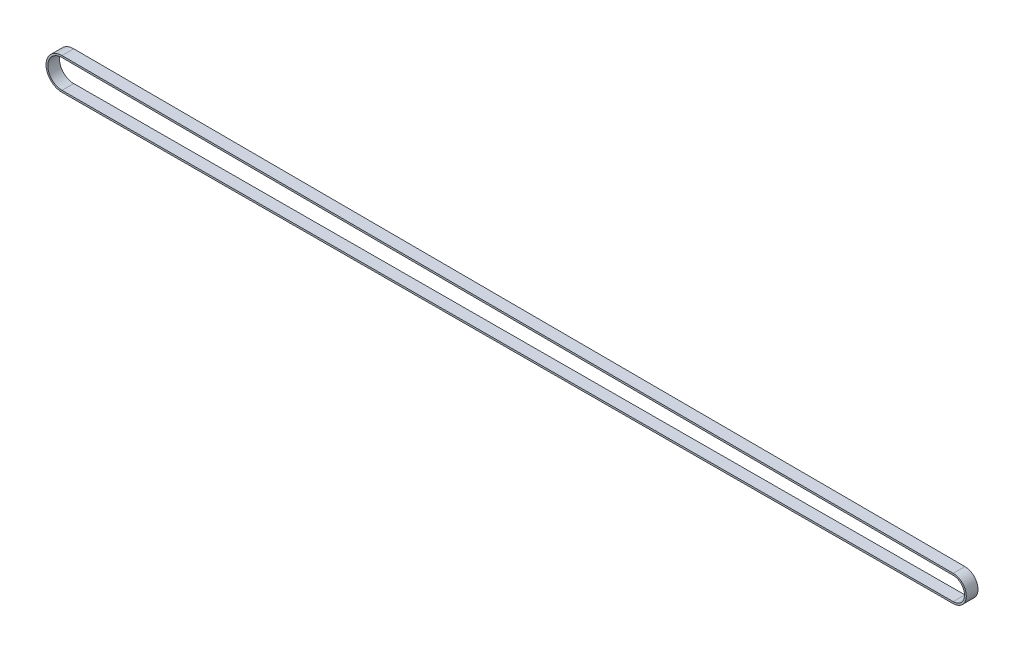
ISO-10303-21;
HEADER;
FILE_DESCRIPTION(('STEP AP214'),'2;1');
FILE_NAME('part.step','',(''),(''),'','','');
FILE_SCHEMA(('AUTOMOTIVE_DESIGN { 1 0 10303 214 1 1 1 1 }'));
ENDSEC;
DATA;
#1=APPLICATION_CONTEXT('core data for automotive mechanical design processes');
#2=APPLICATION_PROTOCOL_DEFINITION('international standard','automotive_design',2000,#1);
#3=PRODUCT_CONTEXT('',#1,'mechanical');
#4=PRODUCT('Part','Part','',(#3));
#5=PRODUCT_RELATED_PRODUCT_CATEGORY('part','',(#4));
#6=PRODUCT_DEFINITION_FORMATION('','',#4);
#7=PRODUCT_DEFINITION_CONTEXT('part definition',#1,'design');
#8=PRODUCT_DEFINITION('design','',#6,#7);
#9=PRODUCT_DEFINITION_SHAPE('','',#8);
#10=(LENGTH_UNIT() NAMED_UNIT(*) SI_UNIT(.MILLI.,.METRE.));
#11=(NAMED_UNIT(*) PLANE_ANGLE_UNIT() SI_UNIT($,.RADIAN.));
#12=(NAMED_UNIT(*) SI_UNIT($,.STERADIAN.) SOLID_ANGLE_UNIT());
#13=UNCERTAINTY_MEASURE_WITH_UNIT(LENGTH_MEASURE(1.E-05),#10,'distance_accuracy_value','');
#14=(GEOMETRIC_REPRESENTATION_CONTEXT(3) GLOBAL_UNCERTAINTY_ASSIGNED_CONTEXT((#13)) GLOBAL_UNIT_ASSIGNED_CONTEXT((#10,
#11,#12)) REPRESENTATION_CONTEXT('',''));
#15=CARTESIAN_POINT('',(0.,0.,0.));
#16=DIRECTION('',(0.,0.,1.));
#17=DIRECTION('',(1.,0.,0.));
#18=AXIS2_PLACEMENT_3D('',#15,#16,#17);
#19=CARTESIAN_POINT('',(-380.500000000015,-37.893771705038,2.5));
#20=DIRECTION('',(0.,0.,-1.));
#21=DIRECTION('',(-1.,0.,0.));
#22=AXIS2_PLACEMENT_3D('',#19,#20,#21);
#23=CYLINDRICAL_SURFACE('',#22,6.812);
#24=CARTESIAN_POINT('',(-380.500000000015,-37.893771705038,-2.5));
#25=DIRECTION('',(0.,0.,-1.));
#26=DIRECTION('',(-1.,0.,0.));
#27=AXIS2_PLACEMENT_3D('',#24,#25,#26);
#28=CIRCLE('',#27,6.812);
#29=CARTESIAN_POINT('',(-380.478516688583,-44.70573782851,-2.5));
#30=VERTEX_POINT('',#29);
#31=CARTESIAN_POINT('',(-380.478516688582,-31.081805581566,-2.5));
#32=VERTEX_POINT('',#31);
#33=EDGE_CURVE('E157',#30,#32,#28,.T.);
#34=ORIENTED_EDGE('',*,*,#33,.F.);
#35=DIRECTION('',(0.,0.,-1.));
#36=VECTOR('',#35,1.);
#37=CARTESIAN_POINT('',(-380.478516688583,-44.70573782851,2.5));
#38=LINE('',#37,#36);
#39=CARTESIAN_POINT('',(-380.478516688583,-44.70573782851,2.5));
#40=VERTEX_POINT('',#39);
#41=EDGE_CURVE('E12',#40,#30,#38,.T.);
#42=ORIENTED_EDGE('',*,*,#41,.F.);
#43=CARTESIAN_POINT('',(-380.500000000015,-37.893771705038,2.5));
#44=DIRECTION('',(0.,0.,-1.));
#45=DIRECTION('',(-1.,0.,0.));
#46=AXIS2_PLACEMENT_3D('',#43,#44,#45);
#47=CIRCLE('',#46,6.812);
#48=CARTESIAN_POINT('',(-380.478516688582,-31.081805581566,2.5));
#49=VERTEX_POINT('',#48);
#50=EDGE_CURVE('E161',#40,#49,#47,.T.);
#51=ORIENTED_EDGE('',*,*,#50,.T.);
#52=DIRECTION('',(0.,0.,-1.));
#53=VECTOR('',#52,1.);
#54=CARTESIAN_POINT('',(-380.478516688582,-31.081805581566,2.5));
#55=LINE('',#54,#53);
#56=EDGE_CURVE('E62',#49,#32,#55,.T.);
#57=ORIENTED_EDGE('',*,*,#56,.T.);
#58=EDGE_LOOP('',(#34,#42,#51,#57));
#59=FACE_BOUND('',#58,.T.);
#60=ADVANCED_FACE('F59',(#59),#23,.T.);
#61=CARTESIAN_POINT('',(-380.478516688583,-44.70573782851,2.5));
#62=DIRECTION('',(0.00315374507221117,-0.999995026933644,0.));
#63=DIRECTION('',(0.999995026933644,0.00315374507221117,0.));
#64=AXIS2_PLACEMENT_3D('',#61,#62,#63);
#65=PLANE('',#64);
#66=DIRECTION('',(-0.999995026933644,-0.00315374507221117,0.));
#67=VECTOR('',#66,1.);
#68=CARTESIAN_POINT('',(-380.478516688583,-44.70573782851,-2.5));
#69=LINE('',#68,#67);
#70=CARTESIAN_POINT('',(0.0176988173309971,-43.5057437962133,-2.5));
#71=VERTEX_POINT('',#70);
#72=EDGE_CURVE('E165',#71,#30,#69,.T.);
#73=ORIENTED_EDGE('',*,*,#72,.F.);
#74=DIRECTION('',(0.,0.,-1.));
#75=VECTOR('',#74,1.);
#76=CARTESIAN_POINT('',(0.0176988173309971,-43.5057437962133,2.5));
#77=LINE('',#76,#75);
#78=CARTESIAN_POINT('',(0.0176988173309971,-43.5057437962133,2.5));
#79=VERTEX_POINT('',#78);
#80=EDGE_CURVE('E67',#79,#71,#77,.T.);
#81=ORIENTED_EDGE('',*,*,#80,.F.);
#82=DIRECTION('',(-0.999995026933644,-0.00315374507221117,0.));
#83=VECTOR('',#82,1.);
#84=CARTESIAN_POINT('',(-380.478516688583,-44.70573782851,2.5));
#85=LINE('',#84,#83);
#86=EDGE_CURVE('E171',#79,#40,#85,.T.);
#87=ORIENTED_EDGE('',*,*,#86,.T.);
#88=ORIENTED_EDGE('',*,*,#41,.T.);
#89=EDGE_LOOP('',(#73,#81,#87,#88));
#90=FACE_BOUND('',#89,.T.);
#91=ADVANCED_FACE('F197',(#90),#65,.T.);
#92=CARTESIAN_POINT('',(-1.42524880786254E-11,-37.8937717050617,2.5));
#93=DIRECTION('',(0.,0.,-1.));
#94=DIRECTION('',(-1.,0.,0.));
#95=AXIS2_PLACEMENT_3D('',#92,#93,#94);
#96=CYLINDRICAL_SURFACE('',#95,5.612);
#97=CARTESIAN_POINT('',(-1.42524880786254E-11,-37.8937717050617,-2.5));
#98=DIRECTION('',(0.,0.,-1.));
#99=DIRECTION('',(-1.,0.,0.));
#100=AXIS2_PLACEMENT_3D('',#97,#98,#99);
#101=CIRCLE('',#100,5.612);
#102=CARTESIAN_POINT('',(0.0176988173316572,-32.2817996139101,-2.5));
#103=VERTEX_POINT('',#102);
#104=EDGE_CURVE('E179',#103,#71,#101,.T.);
#105=ORIENTED_EDGE('',*,*,#104,.F.);
#106=DIRECTION('',(0.,0.,-1.));
#107=VECTOR('',#106,1.);
#108=CARTESIAN_POINT('',(0.0176988173316572,-32.2817996139101,2.5));
#109=LINE('',#108,#107);
#110=CARTESIAN_POINT('',(0.0176988173316572,-32.2817996139101,2.5));
#111=VERTEX_POINT('',#110);
#112=EDGE_CURVE('E184',#111,#103,#109,.T.);
#113=ORIENTED_EDGE('',*,*,#112,.F.);
#114=CARTESIAN_POINT('',(-1.42524880786254E-11,-37.8937717050617,2.5));
#115=DIRECTION('',(0.,0.,-1.));
#116=DIRECTION('',(-1.,0.,0.));
#117=AXIS2_PLACEMENT_3D('',#114,#115,#116);
#118=CIRCLE('',#117,5.612);
#119=EDGE_CURVE('E168',#111,#79,#118,.T.);
#120=ORIENTED_EDGE('',*,*,#119,.T.);
#121=ORIENTED_EDGE('',*,*,#80,.T.);
#122=EDGE_LOOP('',(#105,#113,#120,#121));
#123=FACE_BOUND('',#122,.T.);
#124=ADVANCED_FACE('F201',(#123),#96,.T.);
#125=CARTESIAN_POINT('',(-380.478516688582,-31.081805581566,2.5));
#126=DIRECTION('',(0.00315374507233547,0.999995026933644,0.));
#127=DIRECTION('',(-0.999995026933644,0.00315374507233547,0.));
#128=AXIS2_PLACEMENT_3D('',#125,#126,#127);
#129=PLANE('',#128);
#130=DIRECTION('',(0.999995026933644,-0.00315374507233546,0.));
#131=VECTOR('',#130,1.);
#132=CARTESIAN_POINT('',(-380.478516688582,-31.081805581566,-2.5));
#133=LINE('',#132,#131);
#134=EDGE_CURVE('E176',#32,#103,#133,.T.);
#135=ORIENTED_EDGE('',*,*,#134,.F.);
#136=ORIENTED_EDGE('',*,*,#56,.F.);
#137=DIRECTION('',(0.999995026933644,-0.00315374507233546,0.));
#138=VECTOR('',#137,1.);
#139=CARTESIAN_POINT('',(-380.478516688582,-31.081805581566,2.5));
#140=LINE('',#139,#138);
#141=EDGE_CURVE('E164',#49,#111,#140,.T.);
#142=ORIENTED_EDGE('',*,*,#141,.T.);
#143=ORIENTED_EDGE('',*,*,#112,.T.);
#144=EDGE_LOOP('',(#135,#136,#142,#143));
#145=FACE_BOUND('',#144,.T.);
#146=ADVANCED_FACE('F192',(#145),#129,.T.);
#147=CARTESIAN_POINT('',(-380.500000000015,-37.893771705038,2.5));
#148=DIRECTION('',(0.,0.,-1.));
#149=DIRECTION('',(-1.,0.,0.));
#150=AXIS2_PLACEMENT_3D('',#147,#148,#149);
#151=PLANE('',#150);
#152=DIRECTION('',(-0.999995026933644,-0.00315374507221117,0.));
#153=VECTOR('',#152,1.);
#154=CARTESIAN_POINT('',(-380.480919842328,-43.9437416179866,2.5));
#155=LINE('',#154,#153);
#156=CARTESIAN_POINT('',(0.0152956635859721,-42.7437475856898,2.5));
#157=VERTEX_POINT('',#156);
#158=CARTESIAN_POINT('',(-380.480919842328,-43.9437416179866,2.5));
#159=VERTEX_POINT('',#158);
#160=EDGE_CURVE('E132',#157,#159,#155,.T.);
#161=ORIENTED_EDGE('',*,*,#160,.T.);
#162=CARTESIAN_POINT('',(-380.500000000015,-37.893771705038,2.5));
#163=DIRECTION('',(0.,0.,-1.));
#164=DIRECTION('',(-1.,0.,0.));
#165=AXIS2_PLACEMENT_3D('',#162,#163,#164);
#166=CIRCLE('',#165,6.05);
#167=CARTESIAN_POINT('',(-380.480919842327,-31.8438017920895,2.5));
#168=VERTEX_POINT('',#167);
#169=EDGE_CURVE('E126',#159,#168,#166,.T.);
#170=ORIENTED_EDGE('',*,*,#169,.T.);
#171=DIRECTION('',(0.999995026933644,-0.00315374507233546,0.));
#172=VECTOR('',#171,1.);
#173=CARTESIAN_POINT('',(-380.480919842327,-31.8438017920895,2.5));
#174=LINE('',#173,#172);
#175=CARTESIAN_POINT('',(0.0152956635864898,-33.0437958244335,2.5));
#176=VERTEX_POINT('',#175);
#177=EDGE_CURVE('E135',#168,#176,#174,.T.);
#178=ORIENTED_EDGE('',*,*,#177,.T.);
#179=CARTESIAN_POINT('',(-1.42524880786254E-11,-37.8937717050617,2.5));
#180=DIRECTION('',(0.,0.,-1.));
#181=DIRECTION('',(-1.,0.,0.));
#182=AXIS2_PLACEMENT_3D('',#179,#180,#181);
#183=CIRCLE('',#182,4.85);
#184=EDGE_CURVE('E75',#176,#157,#183,.T.);
#185=ORIENTED_EDGE('',*,*,#184,.T.);
#186=EDGE_LOOP('',(#161,#170,#178,#185));
#187=FACE_BOUND('',#186,.T.);
#188=ORIENTED_EDGE('',*,*,#50,.F.);
#189=ORIENTED_EDGE('',*,*,#86,.F.);
#190=ORIENTED_EDGE('',*,*,#119,.F.);
#191=ORIENTED_EDGE('',*,*,#141,.F.);
#192=EDGE_LOOP('',(#188,#189,#190,#191));
#193=FACE_BOUND('',#192,.T.);
#194=ADVANCED_FACE('F139',(#187,#193),#151,.F.);
#195=CARTESIAN_POINT('',(-380.500000000015,-37.893771705038,-2.5));
#196=DIRECTION('',(0.,0.,-1.));
#197=DIRECTION('',(-1.,0.,0.));
#198=AXIS2_PLACEMENT_3D('',#195,#196,#197);
#199=PLANE('',#198);
#200=CARTESIAN_POINT('',(-380.500000000015,-37.893771705038,-2.5));
#201=DIRECTION('',(0.,0.,-1.));
#202=DIRECTION('',(-1.,0.,0.));
#203=AXIS2_PLACEMENT_3D('',#200,#201,#202);
#204=CIRCLE('',#203,6.05);
#205=CARTESIAN_POINT('',(-380.480919842328,-43.9437416179866,-2.5));
#206=VERTEX_POINT('',#205);
#207=CARTESIAN_POINT('',(-380.480919842327,-31.8438017920895,-2.5));
#208=VERTEX_POINT('',#207);
#209=EDGE_CURVE('E83',#206,#208,#204,.T.);
#210=ORIENTED_EDGE('',*,*,#209,.F.);
#211=DIRECTION('',(-0.999995026933644,-0.00315374507221117,0.));
#212=VECTOR('',#211,1.);
#213=CARTESIAN_POINT('',(-380.480919842328,-43.9437416179866,-2.5));
#214=LINE('',#213,#212);
#215=CARTESIAN_POINT('',(0.0152956635859721,-42.7437475856898,-2.5));
#216=VERTEX_POINT('',#215);
#217=EDGE_CURVE('E142',#216,#206,#214,.T.);
#218=ORIENTED_EDGE('',*,*,#217,.F.);
#219=CARTESIAN_POINT('',(-1.42524880786254E-11,-37.8937717050617,-2.5));
#220=DIRECTION('',(0.,0.,-1.));
#221=DIRECTION('',(-1.,0.,0.));
#222=AXIS2_PLACEMENT_3D('',#219,#220,#221);
#223=CIRCLE('',#222,4.85);
#224=CARTESIAN_POINT('',(0.0152956635865453,-33.0437958244335,-2.5));
#225=VERTEX_POINT('',#224);
#226=EDGE_CURVE('E145',#225,#216,#223,.T.);
#227=ORIENTED_EDGE('',*,*,#226,.F.);
#228=DIRECTION('',(0.999995026933644,-0.00315374507233546,0.));
#229=VECTOR('',#228,1.);
#230=CARTESIAN_POINT('',(-380.480919842327,-31.8438017920895,-2.5));
#231=LINE('',#230,#229);
#232=EDGE_CURVE('E151',#208,#225,#231,.T.);
#233=ORIENTED_EDGE('',*,*,#232,.F.);
#234=EDGE_LOOP('',(#210,#218,#227,#233));
#235=FACE_BOUND('',#234,.T.);
#236=ORIENTED_EDGE('',*,*,#33,.T.);
#237=ORIENTED_EDGE('',*,*,#134,.T.);
#238=ORIENTED_EDGE('',*,*,#104,.T.);
#239=ORIENTED_EDGE('',*,*,#72,.T.);
#240=EDGE_LOOP('',(#236,#237,#238,#239));
#241=FACE_BOUND('',#240,.T.);
#242=ADVANCED_FACE('F194',(#235,#241),#199,.T.);
#243=CARTESIAN_POINT('',(-380.500000000015,-37.893771705038,2.5));
#244=DIRECTION('',(0.,0.,-1.));
#245=DIRECTION('',(-1.,0.,0.));
#246=AXIS2_PLACEMENT_3D('',#243,#244,#245);
#247=CYLINDRICAL_SURFACE('',#246,6.05);
#248=ORIENTED_EDGE('',*,*,#209,.T.);
#249=DIRECTION('',(0.,0.,-1.));
#250=VECTOR('',#249,1.);
#251=CARTESIAN_POINT('',(-380.480919842327,-31.8438017920895,2.5));
#252=LINE('',#251,#250);
#253=EDGE_CURVE('E122',#168,#208,#252,.T.);
#254=ORIENTED_EDGE('',*,*,#253,.F.);
#255=ORIENTED_EDGE('',*,*,#169,.F.);
#256=DIRECTION('',(0.,0.,-1.));
#257=VECTOR('',#256,1.);
#258=CARTESIAN_POINT('',(-380.480919842328,-43.9437416179866,2.5));
#259=LINE('',#258,#257);
#260=EDGE_CURVE('E155',#159,#206,#259,.T.);
#261=ORIENTED_EDGE('',*,*,#260,.T.);
#262=EDGE_LOOP('',(#248,#254,#255,#261));
#263=FACE_BOUND('',#262,.T.);
#264=ADVANCED_FACE('F124',(#263),#247,.F.);
#265=CARTESIAN_POINT('',(-380.480919842328,-43.9437416179866,2.5));
#266=DIRECTION('',(0.00315374507221117,-0.999995026933644,0.));
#267=DIRECTION('',(0.999995026933644,0.00315374507221117,0.));
#268=AXIS2_PLACEMENT_3D('',#265,#266,#267);
#269=PLANE('',#268);
#270=ORIENTED_EDGE('',*,*,#217,.T.);
#271=ORIENTED_EDGE('',*,*,#260,.F.);
#272=ORIENTED_EDGE('',*,*,#160,.F.);
#273=DIRECTION('',(0.,0.,-1.));
#274=VECTOR('',#273,1.);
#275=CARTESIAN_POINT('',(0.0152956635859721,-42.7437475856898,2.5));
#276=LINE('',#275,#274);
#277=EDGE_CURVE('E158',#157,#216,#276,.T.);
#278=ORIENTED_EDGE('',*,*,#277,.T.);
#279=EDGE_LOOP('',(#270,#271,#272,#278));
#280=FACE_BOUND('',#279,.T.);
#281=ADVANCED_FACE('F252',(#280),#269,.F.);
#282=CARTESIAN_POINT('',(-1.42524880786254E-11,-37.8937717050617,2.5));
#283=DIRECTION('',(0.,0.,-1.));
#284=DIRECTION('',(-1.,0.,0.));
#285=AXIS2_PLACEMENT_3D('',#282,#283,#284);
#286=CYLINDRICAL_SURFACE('',#285,4.85);
#287=ORIENTED_EDGE('',*,*,#226,.T.);
#288=ORIENTED_EDGE('',*,*,#277,.F.);
#289=ORIENTED_EDGE('',*,*,#184,.F.);
#290=DIRECTION('',(0.,0.,-1.));
#291=VECTOR('',#290,1.);
#292=CARTESIAN_POINT('',(0.0152956635865453,-33.0437958244335,2.5));
#293=LINE('',#292,#291);
#294=EDGE_CURVE('E131',#176,#225,#293,.T.);
#295=ORIENTED_EDGE('',*,*,#294,.T.);
#296=EDGE_LOOP('',(#287,#288,#289,#295));
#297=FACE_BOUND('',#296,.T.);
#298=ADVANCED_FACE('F261',(#297),#286,.F.);
#299=CARTESIAN_POINT('',(-380.480919842327,-31.8438017920895,2.5));
#300=DIRECTION('',(0.00315374507233547,0.999995026933644,0.));
#301=DIRECTION('',(-0.999995026933644,0.00315374507233547,0.));
#302=AXIS2_PLACEMENT_3D('',#299,#300,#301);
#303=PLANE('',#302);
#304=ORIENTED_EDGE('',*,*,#232,.T.);
#305=ORIENTED_EDGE('',*,*,#294,.F.);
#306=ORIENTED_EDGE('',*,*,#177,.F.);
#307=ORIENTED_EDGE('',*,*,#253,.T.);
#308=EDGE_LOOP('',(#304,#305,#306,#307));
#309=FACE_BOUND('',#308,.T.);
#310=ADVANCED_FACE('F136',(#309),#303,.F.);
#311=CLOSED_SHELL('',(#60,#91,#124,#146,#194,#242,#264,#281,#298,#310));
#312=MANIFOLD_SOLID_BREP('B2',#311);
#313=ADVANCED_BREP_SHAPE_REPRESENTATION('',(#18,#312),#14);
#314=SHAPE_DEFINITION_REPRESENTATION(#9,#313);
ENDSEC;
END-ISO-10303-21;
